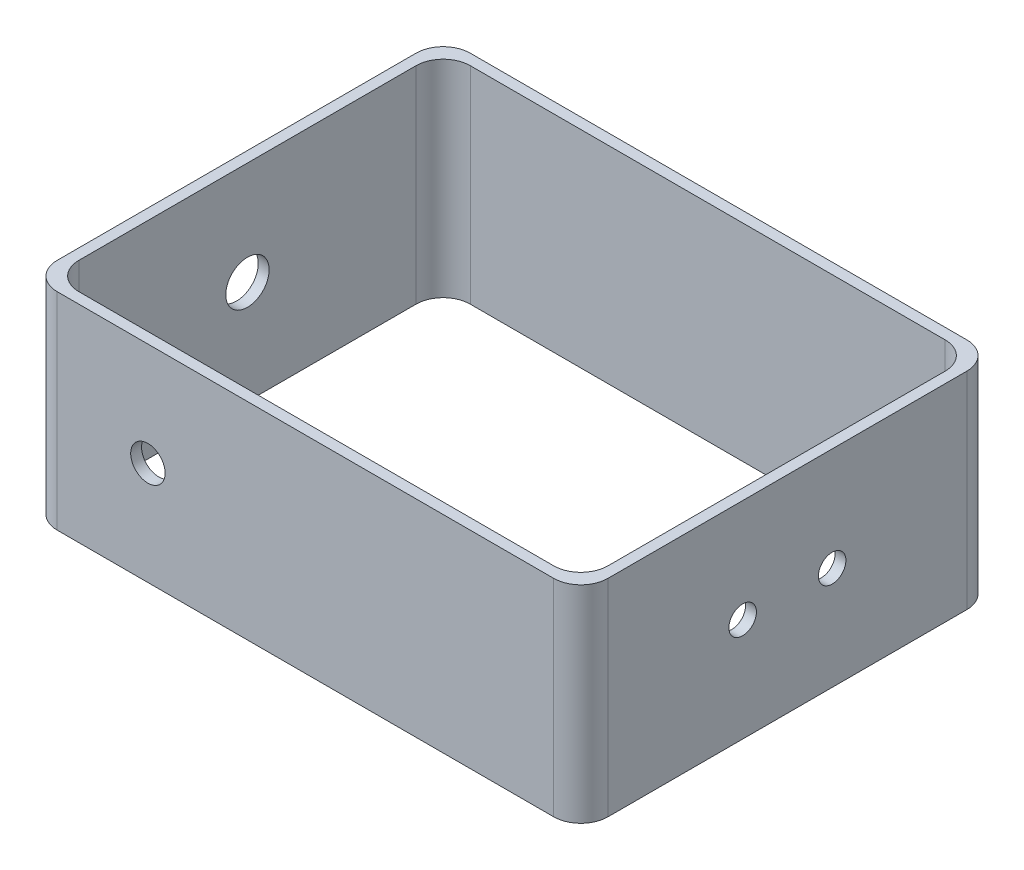
ISO-10303-21;
HEADER;
FILE_DESCRIPTION(('STEP AP214'),'2;1');
FILE_NAME('part.step','',(''),(''),'','','');
FILE_SCHEMA(('AUTOMOTIVE_DESIGN { 1 0 10303 214 1 1 1 1 }'));
ENDSEC;
DATA;
#1=APPLICATION_CONTEXT('core data for automotive mechanical design processes');
#2=APPLICATION_PROTOCOL_DEFINITION('international standard','automotive_design',2000,#1);
#3=PRODUCT_CONTEXT('',#1,'mechanical');
#4=PRODUCT('Part','Part','',(#3));
#5=PRODUCT_RELATED_PRODUCT_CATEGORY('part','',(#4));
#6=PRODUCT_DEFINITION_FORMATION('','',#4);
#7=PRODUCT_DEFINITION_CONTEXT('part definition',#1,'design');
#8=PRODUCT_DEFINITION('design','',#6,#7);
#9=PRODUCT_DEFINITION_SHAPE('','',#8);
#10=(LENGTH_UNIT() NAMED_UNIT(*) SI_UNIT(.MILLI.,.METRE.));
#11=(NAMED_UNIT(*) PLANE_ANGLE_UNIT() SI_UNIT($,.RADIAN.));
#12=(NAMED_UNIT(*) SI_UNIT($,.STERADIAN.) SOLID_ANGLE_UNIT());
#13=UNCERTAINTY_MEASURE_WITH_UNIT(LENGTH_MEASURE(1.E-05),#10,'distance_accuracy_value','');
#14=(GEOMETRIC_REPRESENTATION_CONTEXT(3) GLOBAL_UNCERTAINTY_ASSIGNED_CONTEXT((#13)) GLOBAL_UNIT_ASSIGNED_CONTEXT((#10,
#11,#12)) REPRESENTATION_CONTEXT('',''));
#15=CARTESIAN_POINT('',(0.,0.,0.));
#16=DIRECTION('',(0.,0.,1.));
#17=DIRECTION('',(1.,0.,0.));
#18=AXIS2_PLACEMENT_3D('',#15,#16,#17);
#19=CARTESIAN_POINT('',(50.8,38.1,-38.1));
#20=DIRECTION('',(-1.,0.,0.));
#21=DIRECTION('',(0.,0.,1.));
#22=AXIS2_PLACEMENT_3D('',#19,#20,#21);
#23=PLANE('',#22);
#24=CARTESIAN_POINT('',(50.8,19.05,-8.25500000000002));
#25=DIRECTION('',(1.,0.,0.));
#26=DIRECTION('',(0.,0.,-1.));
#27=AXIS2_PLACEMENT_3D('',#24,#25,#26);
#28=CIRCLE('',#27,2.54);
#29=CARTESIAN_POINT('',(50.8,19.05,-10.795));
#30=VERTEX_POINT('',#29);
#31=EDGE_CURVE('E494',#30,#30,#28,.T.);
#32=ORIENTED_EDGE('',*,*,#31,.F.);
#33=EDGE_LOOP('',(#32));
#34=FACE_BOUND('',#33,.T.);
#35=CARTESIAN_POINT('',(50.8,19.05,8.25499999999998));
#36=DIRECTION('',(1.,0.,0.));
#37=DIRECTION('',(0.,0.,-1.));
#38=AXIS2_PLACEMENT_3D('',#35,#36,#37);
#39=CIRCLE('',#38,2.54);
#40=CARTESIAN_POINT('',(50.8,19.05,5.71499999999998));
#41=VERTEX_POINT('',#40);
#42=EDGE_CURVE('E269',#41,#41,#39,.T.);
#43=ORIENTED_EDGE('',*,*,#42,.F.);
#44=EDGE_LOOP('',(#43));
#45=FACE_BOUND('',#44,.T.);
#46=DIRECTION('',(0.,0.,-1.));
#47=VECTOR('',#46,1.);
#48=CARTESIAN_POINT('',(50.8,0.,-38.1));
#49=LINE('',#48,#47);
#50=CARTESIAN_POINT('',(50.8,0.,33.1));
#51=VERTEX_POINT('',#50);
#52=CARTESIAN_POINT('',(50.8,0.,-33.1));
#53=VERTEX_POINT('',#52);
#54=EDGE_CURVE('E274',#51,#53,#49,.T.);
#55=ORIENTED_EDGE('',*,*,#54,.T.);
#56=DIRECTION('',(0.,-1.,0.));
#57=VECTOR('',#56,1.);
#58=CARTESIAN_POINT('',(50.8,38.1,-33.1));
#59=LINE('',#58,#57);
#60=CARTESIAN_POINT('',(50.8,38.1,-33.1));
#61=VERTEX_POINT('',#60);
#62=EDGE_CURVE('E209',#53,#61,#59,.F.);
#63=ORIENTED_EDGE('',*,*,#62,.T.);
#64=DIRECTION('',(0.,0.,-1.));
#65=VECTOR('',#64,1.);
#66=CARTESIAN_POINT('',(50.8,38.1,-38.1));
#67=LINE('',#66,#65);
#68=CARTESIAN_POINT('',(50.8,38.1,33.1));
#69=VERTEX_POINT('',#68);
#70=EDGE_CURVE('E175',#69,#61,#67,.T.);
#71=ORIENTED_EDGE('',*,*,#70,.F.);
#72=DIRECTION('',(0.,-1.,0.));
#73=VECTOR('',#72,1.);
#74=CARTESIAN_POINT('',(50.8,38.1,33.1));
#75=LINE('',#74,#73);
#76=EDGE_CURVE('E206',#69,#51,#75,.T.);
#77=ORIENTED_EDGE('',*,*,#76,.T.);
#78=EDGE_LOOP('',(#55,#63,#71,#77));
#79=FACE_BOUND('',#78,.T.);
#80=ADVANCED_FACE('F35',(#34,#45,#79),#23,.F.);
#81=CARTESIAN_POINT('',(-50.8,38.1,-38.1));
#82=DIRECTION('',(0.,0.,1.));
#83=DIRECTION('',(1.,0.,0.));
#84=AXIS2_PLACEMENT_3D('',#81,#82,#83);
#85=PLANE('',#84);
#86=DIRECTION('',(-1.,0.,0.));
#87=VECTOR('',#86,1.);
#88=CARTESIAN_POINT('',(-50.8,0.,-38.1));
#89=LINE('',#88,#87);
#90=CARTESIAN_POINT('',(45.8,0.,-38.1));
#91=VERTEX_POINT('',#90);
#92=CARTESIAN_POINT('',(-45.8,0.,-38.1));
#93=VERTEX_POINT('',#92);
#94=EDGE_CURVE('E181',#91,#93,#89,.T.);
#95=ORIENTED_EDGE('',*,*,#94,.T.);
#96=DIRECTION('',(0.,-1.,0.));
#97=VECTOR('',#96,1.);
#98=CARTESIAN_POINT('',(-45.8,38.1,-38.1));
#99=LINE('',#98,#97);
#100=CARTESIAN_POINT('',(-45.8,38.1,-38.1));
#101=VERTEX_POINT('',#100);
#102=EDGE_CURVE('E204',#93,#101,#99,.F.);
#103=ORIENTED_EDGE('',*,*,#102,.T.);
#104=DIRECTION('',(-1.,0.,0.));
#105=VECTOR('',#104,1.);
#106=CARTESIAN_POINT('',(-50.8,38.1,-38.1));
#107=LINE('',#106,#105);
#108=CARTESIAN_POINT('',(45.8,38.1,-38.1));
#109=VERTEX_POINT('',#108);
#110=EDGE_CURVE('E179',#109,#101,#107,.T.);
#111=ORIENTED_EDGE('',*,*,#110,.F.);
#112=DIRECTION('',(0.,-1.,0.));
#113=VECTOR('',#112,1.);
#114=CARTESIAN_POINT('',(45.8,38.1,-38.1));
#115=LINE('',#114,#113);
#116=EDGE_CURVE('E201',#109,#91,#115,.T.);
#117=ORIENTED_EDGE('',*,*,#116,.T.);
#118=EDGE_LOOP('',(#95,#103,#111,#117));
#119=FACE_BOUND('',#118,.T.);
#120=ADVANCED_FACE('F293',(#119),#85,.F.);
#121=CARTESIAN_POINT('',(-50.8,38.1,-38.1));
#122=DIRECTION('',(1.,0.,0.));
#123=DIRECTION('',(0.,0.,-1.));
#124=AXIS2_PLACEMENT_3D('',#121,#122,#123);
#125=PLANE('',#124);
#126=CARTESIAN_POINT('',(-50.8,19.05,0.));
#127=DIRECTION('',(-1.,0.,0.));
#128=DIRECTION('',(0.,0.,1.));
#129=AXIS2_PLACEMENT_3D('',#126,#127,#128);
#130=CIRCLE('',#129,4.);
#131=CARTESIAN_POINT('',(-50.8,19.05,4.00000000000001));
#132=VERTEX_POINT('',#131);
#133=EDGE_CURVE('E499',#132,#132,#130,.T.);
#134=ORIENTED_EDGE('',*,*,#133,.F.);
#135=EDGE_LOOP('',(#134));
#136=FACE_BOUND('',#135,.T.);
#137=DIRECTION('',(0.,0.,1.));
#138=VECTOR('',#137,1.);
#139=CARTESIAN_POINT('',(-50.8,0.,-38.1));
#140=LINE('',#139,#138);
#141=CARTESIAN_POINT('',(-50.8,0.,-33.1));
#142=VERTEX_POINT('',#141);
#143=CARTESIAN_POINT('',(-50.8,0.,33.1));
#144=VERTEX_POINT('',#143);
#145=EDGE_CURVE('E176',#142,#144,#140,.T.);
#146=ORIENTED_EDGE('',*,*,#145,.T.);
#147=DIRECTION('',(0.,-1.,0.));
#148=VECTOR('',#147,1.);
#149=CARTESIAN_POINT('',(-50.8,38.1,33.1));
#150=LINE('',#149,#148);
#151=CARTESIAN_POINT('',(-50.8,38.1,33.1));
#152=VERTEX_POINT('',#151);
#153=EDGE_CURVE('E154',#144,#152,#150,.F.);
#154=ORIENTED_EDGE('',*,*,#153,.T.);
#155=DIRECTION('',(0.,0.,1.));
#156=VECTOR('',#155,1.);
#157=CARTESIAN_POINT('',(-50.8,38.1,-38.1));
#158=LINE('',#157,#156);
#159=CARTESIAN_POINT('',(-50.8,38.1,-33.1));
#160=VERTEX_POINT('',#159);
#161=EDGE_CURVE('E284',#160,#152,#158,.T.);
#162=ORIENTED_EDGE('',*,*,#161,.F.);
#163=DIRECTION('',(0.,-1.,0.));
#164=VECTOR('',#163,1.);
#165=CARTESIAN_POINT('',(-50.8,38.1,-33.1));
#166=LINE('',#165,#164);
#167=EDGE_CURVE('E159',#160,#142,#166,.T.);
#168=ORIENTED_EDGE('',*,*,#167,.T.);
#169=EDGE_LOOP('',(#146,#154,#162,#168));
#170=FACE_BOUND('',#169,.T.);
#171=ADVANCED_FACE('F302',(#136,#170),#125,.F.);
#172=CARTESIAN_POINT('',(-50.8,38.1,38.1));
#173=DIRECTION('',(0.,0.,-1.));
#174=DIRECTION('',(-1.,0.,0.));
#175=AXIS2_PLACEMENT_3D('',#172,#173,#174);
#176=PLANE('',#175);
#177=CARTESIAN_POINT('',(-29.0611601393493,19.05,38.1));
#178=DIRECTION('',(0.,0.,1.));
#179=DIRECTION('',(1.,0.,0.));
#180=AXIS2_PLACEMENT_3D('',#177,#178,#179);
#181=CIRCLE('',#180,3.175);
#182=CARTESIAN_POINT('',(-25.8861601393493,19.05,38.1));
#183=VERTEX_POINT('',#182);
#184=EDGE_CURVE('E516',#183,#183,#181,.T.);
#185=ORIENTED_EDGE('',*,*,#184,.F.);
#186=EDGE_LOOP('',(#185));
#187=FACE_BOUND('',#186,.T.);
#188=DIRECTION('',(1.,0.,0.));
#189=VECTOR('',#188,1.);
#190=CARTESIAN_POINT('',(-50.8,38.1,38.1));
#191=LINE('',#190,#189);
#192=CARTESIAN_POINT('',(-45.8,38.1,38.1));
#193=VERTEX_POINT('',#192);
#194=CARTESIAN_POINT('',(45.8,38.1,38.1));
#195=VERTEX_POINT('',#194);
#196=EDGE_CURVE('E169',#193,#195,#191,.T.);
#197=ORIENTED_EDGE('',*,*,#196,.F.);
#198=DIRECTION('',(0.,-1.,0.));
#199=VECTOR('',#198,1.);
#200=CARTESIAN_POINT('',(-45.8,38.1,38.1));
#201=LINE('',#200,#199);
#202=CARTESIAN_POINT('',(-45.8,0.,38.1));
#203=VERTEX_POINT('',#202);
#204=EDGE_CURVE('E153',#193,#203,#201,.T.);
#205=ORIENTED_EDGE('',*,*,#204,.T.);
#206=DIRECTION('',(1.,0.,0.));
#207=VECTOR('',#206,1.);
#208=CARTESIAN_POINT('',(-50.8,0.,38.1));
#209=LINE('',#208,#207);
#210=CARTESIAN_POINT('',(45.8,0.,38.1));
#211=VERTEX_POINT('',#210);
#212=EDGE_CURVE('E166',#203,#211,#209,.T.);
#213=ORIENTED_EDGE('',*,*,#212,.T.);
#214=DIRECTION('',(0.,-1.,0.));
#215=VECTOR('',#214,1.);
#216=CARTESIAN_POINT('',(45.8,38.1,38.1));
#217=LINE('',#216,#215);
#218=EDGE_CURVE('E171',#211,#195,#217,.F.);
#219=ORIENTED_EDGE('',*,*,#218,.T.);
#220=EDGE_LOOP('',(#197,#205,#213,#219));
#221=FACE_BOUND('',#220,.T.);
#222=ADVANCED_FACE('F165',(#187,#221),#176,.F.);
#223=CARTESIAN_POINT('',(0.,38.1,0.));
#224=DIRECTION('',(0.,1.,0.));
#225=DIRECTION('',(0.,0.,1.));
#226=AXIS2_PLACEMENT_3D('',#223,#224,#225);
#227=PLANE('',#226);
#228=DIRECTION('',(1.,0.,0.));
#229=VECTOR('',#228,1.);
#230=CARTESIAN_POINT('',(-48.8,38.1,36.1));
#231=LINE('',#230,#229);
#232=CARTESIAN_POINT('',(-43.8,38.1,36.1));
#233=VERTEX_POINT('',#232);
#234=CARTESIAN_POINT('',(43.8,38.1,36.1));
#235=VERTEX_POINT('',#234);
#236=EDGE_CURVE('E247',#233,#235,#231,.T.);
#237=ORIENTED_EDGE('',*,*,#236,.F.);
#238=CARTESIAN_POINT('',(-43.8,38.1,31.1));
#239=DIRECTION('',(0.,1.,0.));
#240=DIRECTION('',(0.,0.,1.));
#241=AXIS2_PLACEMENT_3D('',#238,#239,#240);
#242=CIRCLE('',#241,5.);
#243=CARTESIAN_POINT('',(-48.8,38.1,31.1));
#244=VERTEX_POINT('',#243);
#245=EDGE_CURVE('E43',#233,#244,#242,.F.);
#246=ORIENTED_EDGE('',*,*,#245,.T.);
#247=DIRECTION('',(0.,0.,1.));
#248=VECTOR('',#247,1.);
#249=CARTESIAN_POINT('',(-48.8,38.1,-36.1));
#250=LINE('',#249,#248);
#251=CARTESIAN_POINT('',(-48.8,38.1,-31.1));
#252=VERTEX_POINT('',#251);
#253=EDGE_CURVE('E245',#252,#244,#250,.T.);
#254=ORIENTED_EDGE('',*,*,#253,.F.);
#255=CARTESIAN_POINT('',(-43.8,38.1,-31.1));
#256=DIRECTION('',(0.,1.,0.));
#257=DIRECTION('',(0.,0.,1.));
#258=AXIS2_PLACEMENT_3D('',#255,#256,#257);
#259=CIRCLE('',#258,5.);
#260=CARTESIAN_POINT('',(-43.8,38.1,-36.1));
#261=VERTEX_POINT('',#260);
#262=EDGE_CURVE('E238',#252,#261,#259,.F.);
#263=ORIENTED_EDGE('',*,*,#262,.T.);
#264=DIRECTION('',(-1.,0.,0.));
#265=VECTOR('',#264,1.);
#266=CARTESIAN_POINT('',(48.8,38.1,-36.1));
#267=LINE('',#266,#265);
#268=CARTESIAN_POINT('',(43.8,38.1,-36.1));
#269=VERTEX_POINT('',#268);
#270=EDGE_CURVE('E253',#269,#261,#267,.T.);
#271=ORIENTED_EDGE('',*,*,#270,.F.);
#272=CARTESIAN_POINT('',(43.8,38.1,-31.1));
#273=DIRECTION('',(0.,1.,0.));
#274=DIRECTION('',(0.,0.,1.));
#275=AXIS2_PLACEMENT_3D('',#272,#273,#274);
#276=CIRCLE('',#275,5.);
#277=CARTESIAN_POINT('',(48.8,38.1,-31.1));
#278=VERTEX_POINT('',#277);
#279=EDGE_CURVE('E230',#269,#278,#276,.F.);
#280=ORIENTED_EDGE('',*,*,#279,.T.);
#281=DIRECTION('',(0.,0.,-1.));
#282=VECTOR('',#281,1.);
#283=CARTESIAN_POINT('',(48.8,38.1,36.1));
#284=LINE('',#283,#282);
#285=CARTESIAN_POINT('',(48.8,38.1,31.1));
#286=VERTEX_POINT('',#285);
#287=EDGE_CURVE('E276',#286,#278,#284,.T.);
#288=ORIENTED_EDGE('',*,*,#287,.F.);
#289=CARTESIAN_POINT('',(43.8,38.1,31.1));
#290=DIRECTION('',(0.,1.,0.));
#291=DIRECTION('',(0.,0.,1.));
#292=AXIS2_PLACEMENT_3D('',#289,#290,#291);
#293=CIRCLE('',#292,5.);
#294=EDGE_CURVE('E234',#286,#235,#293,.F.);
#295=ORIENTED_EDGE('',*,*,#294,.T.);
#296=EDGE_LOOP('',(#237,#246,#254,#263,#271,#280,#288,#295));
#297=FACE_BOUND('',#296,.T.);
#298=ORIENTED_EDGE('',*,*,#161,.T.);
#299=CARTESIAN_POINT('',(-45.8,38.1,33.1));
#300=DIRECTION('',(0.,1.,0.));
#301=DIRECTION('',(0.,0.,1.));
#302=AXIS2_PLACEMENT_3D('',#299,#300,#301);
#303=CIRCLE('',#302,5.);
#304=EDGE_CURVE('E199',#152,#193,#303,.T.);
#305=ORIENTED_EDGE('',*,*,#304,.T.);
#306=ORIENTED_EDGE('',*,*,#196,.T.);
#307=CARTESIAN_POINT('',(45.8,38.1,33.1));
#308=DIRECTION('',(0.,1.,0.));
#309=DIRECTION('',(0.,0.,1.));
#310=AXIS2_PLACEMENT_3D('',#307,#308,#309);
#311=CIRCLE('',#310,5.);
#312=EDGE_CURVE('E193',#195,#69,#311,.T.);
#313=ORIENTED_EDGE('',*,*,#312,.T.);
#314=ORIENTED_EDGE('',*,*,#70,.T.);
#315=CARTESIAN_POINT('',(45.8,38.1,-33.1));
#316=DIRECTION('',(0.,1.,0.));
#317=DIRECTION('',(0.,0.,1.));
#318=AXIS2_PLACEMENT_3D('',#315,#316,#317);
#319=CIRCLE('',#318,5.);
#320=EDGE_CURVE('E195',#61,#109,#319,.T.);
#321=ORIENTED_EDGE('',*,*,#320,.T.);
#322=ORIENTED_EDGE('',*,*,#110,.T.);
#323=CARTESIAN_POINT('',(-45.8,38.1,-33.1));
#324=DIRECTION('',(0.,1.,0.));
#325=DIRECTION('',(0.,0.,1.));
#326=AXIS2_PLACEMENT_3D('',#323,#324,#325);
#327=CIRCLE('',#326,5.);
#328=EDGE_CURVE('E197',#101,#160,#327,.T.);
#329=ORIENTED_EDGE('',*,*,#328,.T.);
#330=EDGE_LOOP('',(#298,#305,#306,#313,#314,#321,#322,#329));
#331=FACE_BOUND('',#330,.T.);
#332=ADVANCED_FACE('F243',(#297,#331),#227,.T.);
#333=CARTESIAN_POINT('',(0.,0.,0.));
#334=DIRECTION('',(0.,1.,0.));
#335=DIRECTION('',(0.,0.,1.));
#336=AXIS2_PLACEMENT_3D('',#333,#334,#335);
#337=PLANE('',#336);
#338=DIRECTION('',(-1.,0.,0.));
#339=VECTOR('',#338,1.);
#340=CARTESIAN_POINT('',(48.8,0.,-36.1));
#341=LINE('',#340,#339);
#342=CARTESIAN_POINT('',(43.8,0.,-36.1));
#343=VERTEX_POINT('',#342);
#344=CARTESIAN_POINT('',(-43.8,0.,-36.1));
#345=VERTEX_POINT('',#344);
#346=EDGE_CURVE('E266',#343,#345,#341,.T.);
#347=ORIENTED_EDGE('',*,*,#346,.T.);
#348=CARTESIAN_POINT('',(-43.8,0.,-31.1));
#349=DIRECTION('',(0.,1.,0.));
#350=DIRECTION('',(0.,0.,1.));
#351=AXIS2_PLACEMENT_3D('',#348,#349,#350);
#352=CIRCLE('',#351,5.);
#353=CARTESIAN_POINT('',(-48.8,0.,-31.1));
#354=VERTEX_POINT('',#353);
#355=EDGE_CURVE('E57',#345,#354,#352,.T.);
#356=ORIENTED_EDGE('',*,*,#355,.T.);
#357=DIRECTION('',(0.,0.,1.));
#358=VECTOR('',#357,1.);
#359=CARTESIAN_POINT('',(-48.8,0.,-36.1));
#360=LINE('',#359,#358);
#361=CARTESIAN_POINT('',(-48.8,0.,31.1));
#362=VERTEX_POINT('',#361);
#363=EDGE_CURVE('E259',#354,#362,#360,.T.);
#364=ORIENTED_EDGE('',*,*,#363,.T.);
#365=CARTESIAN_POINT('',(-43.8,0.,31.1));
#366=DIRECTION('',(0.,1.,0.));
#367=DIRECTION('',(0.,0.,1.));
#368=AXIS2_PLACEMENT_3D('',#365,#366,#367);
#369=CIRCLE('',#368,5.);
#370=CARTESIAN_POINT('',(-43.8,0.,36.1));
#371=VERTEX_POINT('',#370);
#372=EDGE_CURVE('E11',#362,#371,#369,.T.);
#373=ORIENTED_EDGE('',*,*,#372,.T.);
#374=DIRECTION('',(1.,0.,0.));
#375=VECTOR('',#374,1.);
#376=CARTESIAN_POINT('',(-48.8,0.,36.1));
#377=LINE('',#376,#375);
#378=CARTESIAN_POINT('',(43.8,0.,36.1));
#379=VERTEX_POINT('',#378);
#380=EDGE_CURVE('E252',#371,#379,#377,.T.);
#381=ORIENTED_EDGE('',*,*,#380,.T.);
#382=CARTESIAN_POINT('',(43.8,0.,31.1));
#383=DIRECTION('',(0.,1.,0.));
#384=DIRECTION('',(0.,0.,1.));
#385=AXIS2_PLACEMENT_3D('',#382,#383,#384);
#386=CIRCLE('',#385,5.);
#387=CARTESIAN_POINT('',(48.8,0.,31.1));
#388=VERTEX_POINT('',#387);
#389=EDGE_CURVE('E236',#379,#388,#386,.T.);
#390=ORIENTED_EDGE('',*,*,#389,.T.);
#391=DIRECTION('',(0.,0.,-1.));
#392=VECTOR('',#391,1.);
#393=CARTESIAN_POINT('',(48.8,0.,36.1));
#394=LINE('',#393,#392);
#395=CARTESIAN_POINT('',(48.8,0.,-31.1));
#396=VERTEX_POINT('',#395);
#397=EDGE_CURVE('E263',#388,#396,#394,.T.);
#398=ORIENTED_EDGE('',*,*,#397,.T.);
#399=CARTESIAN_POINT('',(43.8,0.,-31.1));
#400=DIRECTION('',(0.,1.,0.));
#401=DIRECTION('',(0.,0.,1.));
#402=AXIS2_PLACEMENT_3D('',#399,#400,#401);
#403=CIRCLE('',#402,5.);
#404=EDGE_CURVE('E232',#396,#343,#403,.T.);
#405=ORIENTED_EDGE('',*,*,#404,.T.);
#406=EDGE_LOOP('',(#347,#356,#364,#373,#381,#390,#398,#405));
#407=FACE_BOUND('',#406,.T.);
#408=ORIENTED_EDGE('',*,*,#212,.F.);
#409=CARTESIAN_POINT('',(-45.8,0.,33.1));
#410=DIRECTION('',(0.,1.,0.));
#411=DIRECTION('',(0.,0.,1.));
#412=AXIS2_PLACEMENT_3D('',#409,#410,#411);
#413=CIRCLE('',#412,5.);
#414=EDGE_CURVE('E149',#203,#144,#413,.F.);
#415=ORIENTED_EDGE('',*,*,#414,.T.);
#416=ORIENTED_EDGE('',*,*,#145,.F.);
#417=CARTESIAN_POINT('',(-45.8,0.,-33.1));
#418=DIRECTION('',(0.,1.,0.));
#419=DIRECTION('',(0.,0.,1.));
#420=AXIS2_PLACEMENT_3D('',#417,#418,#419);
#421=CIRCLE('',#420,5.);
#422=EDGE_CURVE('E160',#142,#93,#421,.F.);
#423=ORIENTED_EDGE('',*,*,#422,.T.);
#424=ORIENTED_EDGE('',*,*,#94,.F.);
#425=CARTESIAN_POINT('',(45.8,0.,-33.1));
#426=DIRECTION('',(0.,1.,0.));
#427=DIRECTION('',(0.,0.,1.));
#428=AXIS2_PLACEMENT_3D('',#425,#426,#427);
#429=CIRCLE('',#428,5.);
#430=EDGE_CURVE('E187',#91,#53,#429,.F.);
#431=ORIENTED_EDGE('',*,*,#430,.T.);
#432=ORIENTED_EDGE('',*,*,#54,.F.);
#433=CARTESIAN_POINT('',(45.8,0.,33.1));
#434=DIRECTION('',(0.,1.,0.));
#435=DIRECTION('',(0.,0.,1.));
#436=AXIS2_PLACEMENT_3D('',#433,#434,#435);
#437=CIRCLE('',#436,5.);
#438=EDGE_CURVE('E170',#51,#211,#437,.F.);
#439=ORIENTED_EDGE('',*,*,#438,.T.);
#440=EDGE_LOOP('',(#408,#415,#416,#423,#424,#431,#432,#439));
#441=FACE_BOUND('',#440,.T.);
#442=ADVANCED_FACE('F173',(#407,#441),#337,.F.);
#443=CARTESIAN_POINT('',(-48.8,0.,36.1));
#444=DIRECTION('',(0.,0.,1.));
#445=DIRECTION('',(1.,0.,0.));
#446=AXIS2_PLACEMENT_3D('',#443,#444,#445);
#447=PLANE('',#446);
#448=CARTESIAN_POINT('',(-29.0611601393493,19.05,36.1));
#449=DIRECTION('',(0.,0.,1.));
#450=DIRECTION('',(1.,0.,0.));
#451=AXIS2_PLACEMENT_3D('',#448,#449,#450);
#452=CIRCLE('',#451,3.175);
#453=CARTESIAN_POINT('',(-25.8861601393493,19.05,36.1));
#454=VERTEX_POINT('',#453);
#455=EDGE_CURVE('E514',#454,#454,#452,.T.);
#456=ORIENTED_EDGE('',*,*,#455,.T.);
#457=EDGE_LOOP('',(#456));
#458=FACE_BOUND('',#457,.T.);
#459=ORIENTED_EDGE('',*,*,#236,.T.);
#460=DIRECTION('',(0.,1.,0.));
#461=VECTOR('',#460,1.);
#462=CARTESIAN_POINT('',(43.8,0.,36.1));
#463=LINE('',#462,#461);
#464=EDGE_CURVE('E224',#235,#379,#463,.F.);
#465=ORIENTED_EDGE('',*,*,#464,.T.);
#466=ORIENTED_EDGE('',*,*,#380,.F.);
#467=DIRECTION('',(0.,1.,0.));
#468=VECTOR('',#467,1.);
#469=CARTESIAN_POINT('',(-43.8,38.1,36.1));
#470=LINE('',#469,#468);
#471=EDGE_CURVE('E221',#371,#233,#470,.T.);
#472=ORIENTED_EDGE('',*,*,#471,.T.);
#473=EDGE_LOOP('',(#459,#465,#466,#472));
#474=FACE_BOUND('',#473,.T.);
#475=ADVANCED_FACE('F261',(#458,#474),#447,.F.);
#476=CARTESIAN_POINT('',(-48.8,0.,-36.1));
#477=DIRECTION('',(-1.,0.,0.));
#478=DIRECTION('',(0.,0.,1.));
#479=AXIS2_PLACEMENT_3D('',#476,#477,#478);
#480=PLANE('',#479);
#481=CARTESIAN_POINT('',(-48.8,19.05,0.));
#482=DIRECTION('',(-1.,0.,0.));
#483=DIRECTION('',(0.,0.,1.));
#484=AXIS2_PLACEMENT_3D('',#481,#482,#483);
#485=CIRCLE('',#484,4.);
#486=CARTESIAN_POINT('',(-48.8,19.05,4.00000000000001));
#487=VERTEX_POINT('',#486);
#488=EDGE_CURVE('E495',#487,#487,#485,.T.);
#489=ORIENTED_EDGE('',*,*,#488,.T.);
#490=EDGE_LOOP('',(#489));
#491=FACE_BOUND('',#490,.T.);
#492=ORIENTED_EDGE('',*,*,#363,.F.);
#493=DIRECTION('',(0.,1.,0.));
#494=VECTOR('',#493,1.);
#495=CARTESIAN_POINT('',(-48.8,38.1,-31.1));
#496=LINE('',#495,#494);
#497=EDGE_CURVE('E227',#354,#252,#496,.T.);
#498=ORIENTED_EDGE('',*,*,#497,.T.);
#499=ORIENTED_EDGE('',*,*,#253,.T.);
#500=DIRECTION('',(0.,1.,0.));
#501=VECTOR('',#500,1.);
#502=CARTESIAN_POINT('',(-48.8,0.,31.1));
#503=LINE('',#502,#501);
#504=EDGE_CURVE('E50',#244,#362,#503,.F.);
#505=ORIENTED_EDGE('',*,*,#504,.T.);
#506=EDGE_LOOP('',(#492,#498,#499,#505));
#507=FACE_BOUND('',#506,.T.);
#508=ADVANCED_FACE('F250',(#491,#507),#480,.F.);
#509=CARTESIAN_POINT('',(48.8,0.,-36.1));
#510=DIRECTION('',(0.,0.,-1.));
#511=DIRECTION('',(-1.,0.,0.));
#512=AXIS2_PLACEMENT_3D('',#509,#510,#511);
#513=PLANE('',#512);
#514=ORIENTED_EDGE('',*,*,#346,.F.);
#515=DIRECTION('',(0.,1.,0.));
#516=VECTOR('',#515,1.);
#517=CARTESIAN_POINT('',(43.8,38.1,-36.1));
#518=LINE('',#517,#516);
#519=EDGE_CURVE('E213',#343,#269,#518,.T.);
#520=ORIENTED_EDGE('',*,*,#519,.T.);
#521=ORIENTED_EDGE('',*,*,#270,.T.);
#522=DIRECTION('',(0.,1.,0.));
#523=VECTOR('',#522,1.);
#524=CARTESIAN_POINT('',(-43.8,0.,-36.1));
#525=LINE('',#524,#523);
#526=EDGE_CURVE('E211',#261,#345,#525,.F.);
#527=ORIENTED_EDGE('',*,*,#526,.T.);
#528=EDGE_LOOP('',(#514,#520,#521,#527));
#529=FACE_BOUND('',#528,.T.);
#530=ADVANCED_FACE('F352',(#529),#513,.F.);
#531=CARTESIAN_POINT('',(48.8,0.,36.1));
#532=DIRECTION('',(1.,0.,0.));
#533=DIRECTION('',(0.,0.,-1.));
#534=AXIS2_PLACEMENT_3D('',#531,#532,#533);
#535=PLANE('',#534);
#536=CARTESIAN_POINT('',(48.8,19.05,-8.25500000000002));
#537=DIRECTION('',(1.,0.,0.));
#538=DIRECTION('',(0.,0.,-1.));
#539=AXIS2_PLACEMENT_3D('',#536,#537,#538);
#540=CIRCLE('',#539,2.54);
#541=CARTESIAN_POINT('',(48.8,19.05,-10.795));
#542=VERTEX_POINT('',#541);
#543=EDGE_CURVE('E492',#542,#542,#540,.T.);
#544=ORIENTED_EDGE('',*,*,#543,.T.);
#545=EDGE_LOOP('',(#544));
#546=FACE_BOUND('',#545,.T.);
#547=CARTESIAN_POINT('',(48.8,19.05,8.25499999999998));
#548=DIRECTION('',(1.,0.,0.));
#549=DIRECTION('',(0.,0.,-1.));
#550=AXIS2_PLACEMENT_3D('',#547,#548,#549);
#551=CIRCLE('',#550,2.54);
#552=CARTESIAN_POINT('',(48.8,19.05,5.71499999999998));
#553=VERTEX_POINT('',#552);
#554=EDGE_CURVE('E277',#553,#553,#551,.T.);
#555=ORIENTED_EDGE('',*,*,#554,.T.);
#556=EDGE_LOOP('',(#555));
#557=FACE_BOUND('',#556,.T.);
#558=ORIENTED_EDGE('',*,*,#287,.T.);
#559=DIRECTION('',(0.,1.,0.));
#560=VECTOR('',#559,1.);
#561=CARTESIAN_POINT('',(48.8,0.,-31.1));
#562=LINE('',#561,#560);
#563=EDGE_CURVE('E219',#278,#396,#562,.F.);
#564=ORIENTED_EDGE('',*,*,#563,.T.);
#565=ORIENTED_EDGE('',*,*,#397,.F.);
#566=DIRECTION('',(0.,1.,0.));
#567=VECTOR('',#566,1.);
#568=CARTESIAN_POINT('',(48.8,38.1,31.1));
#569=LINE('',#568,#567);
#570=EDGE_CURVE('E216',#388,#286,#569,.T.);
#571=ORIENTED_EDGE('',*,*,#570,.T.);
#572=EDGE_LOOP('',(#558,#564,#565,#571));
#573=FACE_BOUND('',#572,.T.);
#574=ADVANCED_FACE('F358',(#546,#557,#573),#535,.F.);
#575=CARTESIAN_POINT('',(48.8,19.05,8.25499999999998));
#576=DIRECTION('',(1.,0.,0.));
#577=DIRECTION('',(0.,0.,-1.));
#578=AXIS2_PLACEMENT_3D('',#575,#576,#577);
#579=CYLINDRICAL_SURFACE('',#578,2.54);
#580=ORIENTED_EDGE('',*,*,#554,.F.);
#581=EDGE_LOOP('',(#580));
#582=FACE_BOUND('',#581,.T.);
#583=ORIENTED_EDGE('',*,*,#42,.T.);
#584=EDGE_LOOP('',(#583));
#585=FACE_BOUND('',#584,.T.);
#586=ADVANCED_FACE('F362',(#582,#585),#579,.F.);
#587=CARTESIAN_POINT('',(48.8,19.05,-8.25500000000002));
#588=DIRECTION('',(1.,0.,0.));
#589=DIRECTION('',(0.,0.,-1.));
#590=AXIS2_PLACEMENT_3D('',#587,#588,#589);
#591=CYLINDRICAL_SURFACE('',#590,2.54);
#592=ORIENTED_EDGE('',*,*,#543,.F.);
#593=EDGE_LOOP('',(#592));
#594=FACE_BOUND('',#593,.T.);
#595=ORIENTED_EDGE('',*,*,#31,.T.);
#596=EDGE_LOOP('',(#595));
#597=FACE_BOUND('',#596,.T.);
#598=ADVANCED_FACE('F369',(#594,#597),#591,.F.);
#599=CARTESIAN_POINT('',(-48.8,19.05,0.));
#600=DIRECTION('',(-1.,0.,0.));
#601=DIRECTION('',(0.,0.,1.));
#602=AXIS2_PLACEMENT_3D('',#599,#600,#601);
#603=CYLINDRICAL_SURFACE('',#602,4.);
#604=ORIENTED_EDGE('',*,*,#488,.F.);
#605=EDGE_LOOP('',(#604));
#606=FACE_BOUND('',#605,.T.);
#607=ORIENTED_EDGE('',*,*,#133,.T.);
#608=EDGE_LOOP('',(#607));
#609=FACE_BOUND('',#608,.T.);
#610=ADVANCED_FACE('F453',(#606,#609),#603,.F.);
#611=CARTESIAN_POINT('',(-29.0611601393493,19.05,36.1));
#612=DIRECTION('',(0.,0.,1.));
#613=DIRECTION('',(1.,0.,0.));
#614=AXIS2_PLACEMENT_3D('',#611,#612,#613);
#615=CYLINDRICAL_SURFACE('',#614,3.175);
#616=ORIENTED_EDGE('',*,*,#455,.F.);
#617=EDGE_LOOP('',(#616));
#618=FACE_BOUND('',#617,.T.);
#619=ORIENTED_EDGE('',*,*,#184,.T.);
#620=EDGE_LOOP('',(#619));
#621=FACE_BOUND('',#620,.T.);
#622=ADVANCED_FACE('F324',(#618,#621),#615,.F.);
#623=CARTESIAN_POINT('',(-45.8,38.1,33.1));
#624=DIRECTION('',(0.,-1.,0.));
#625=DIRECTION('',(0.,0.,-1.));
#626=AXIS2_PLACEMENT_3D('',#623,#624,#625);
#627=CYLINDRICAL_SURFACE('',#626,5.);
#628=ORIENTED_EDGE('',*,*,#304,.F.);
#629=ORIENTED_EDGE('',*,*,#153,.F.);
#630=ORIENTED_EDGE('',*,*,#414,.F.);
#631=ORIENTED_EDGE('',*,*,#204,.F.);
#632=EDGE_LOOP('',(#628,#629,#630,#631));
#633=FACE_BOUND('',#632,.T.);
#634=ADVANCED_FACE('F152',(#633),#627,.T.);
#635=CARTESIAN_POINT('',(-45.8,38.1,-33.1));
#636=DIRECTION('',(0.,-1.,0.));
#637=DIRECTION('',(0.,0.,-1.));
#638=AXIS2_PLACEMENT_3D('',#635,#636,#637);
#639=CYLINDRICAL_SURFACE('',#638,5.);
#640=ORIENTED_EDGE('',*,*,#328,.F.);
#641=ORIENTED_EDGE('',*,*,#102,.F.);
#642=ORIENTED_EDGE('',*,*,#422,.F.);
#643=ORIENTED_EDGE('',*,*,#167,.F.);
#644=EDGE_LOOP('',(#640,#641,#642,#643));
#645=FACE_BOUND('',#644,.T.);
#646=ADVANCED_FACE('F298',(#645),#639,.T.);
#647=CARTESIAN_POINT('',(45.8,38.1,-33.1));
#648=DIRECTION('',(0.,-1.,0.));
#649=DIRECTION('',(0.,0.,-1.));
#650=AXIS2_PLACEMENT_3D('',#647,#648,#649);
#651=CYLINDRICAL_SURFACE('',#650,5.);
#652=ORIENTED_EDGE('',*,*,#320,.F.);
#653=ORIENTED_EDGE('',*,*,#62,.F.);
#654=ORIENTED_EDGE('',*,*,#430,.F.);
#655=ORIENTED_EDGE('',*,*,#116,.F.);
#656=EDGE_LOOP('',(#652,#653,#654,#655));
#657=FACE_BOUND('',#656,.T.);
#658=ADVANCED_FACE('F327',(#657),#651,.T.);
#659=CARTESIAN_POINT('',(45.8,38.1,33.1));
#660=DIRECTION('',(0.,-1.,0.));
#661=DIRECTION('',(0.,0.,-1.));
#662=AXIS2_PLACEMENT_3D('',#659,#660,#661);
#663=CYLINDRICAL_SURFACE('',#662,5.);
#664=ORIENTED_EDGE('',*,*,#312,.F.);
#665=ORIENTED_EDGE('',*,*,#218,.F.);
#666=ORIENTED_EDGE('',*,*,#438,.F.);
#667=ORIENTED_EDGE('',*,*,#76,.F.);
#668=EDGE_LOOP('',(#664,#665,#666,#667));
#669=FACE_BOUND('',#668,.T.);
#670=ADVANCED_FACE('F330',(#669),#663,.T.);
#671=CARTESIAN_POINT('',(43.8,0.,-31.1));
#672=DIRECTION('',(0.,-1.,0.));
#673=DIRECTION('',(0.,0.,-1.));
#674=AXIS2_PLACEMENT_3D('',#671,#672,#673);
#675=CYLINDRICAL_SURFACE('',#674,5.);
#676=ORIENTED_EDGE('',*,*,#404,.F.);
#677=ORIENTED_EDGE('',*,*,#563,.F.);
#678=ORIENTED_EDGE('',*,*,#279,.F.);
#679=ORIENTED_EDGE('',*,*,#519,.F.);
#680=EDGE_LOOP('',(#676,#677,#678,#679));
#681=FACE_BOUND('',#680,.T.);
#682=ADVANCED_FACE('F334',(#681),#675,.F.);
#683=CARTESIAN_POINT('',(43.8,0.,31.1));
#684=DIRECTION('',(0.,-1.,0.));
#685=DIRECTION('',(0.,0.,-1.));
#686=AXIS2_PLACEMENT_3D('',#683,#684,#685);
#687=CYLINDRICAL_SURFACE('',#686,5.);
#688=ORIENTED_EDGE('',*,*,#389,.F.);
#689=ORIENTED_EDGE('',*,*,#464,.F.);
#690=ORIENTED_EDGE('',*,*,#294,.F.);
#691=ORIENTED_EDGE('',*,*,#570,.F.);
#692=EDGE_LOOP('',(#688,#689,#690,#691));
#693=FACE_BOUND('',#692,.T.);
#694=ADVANCED_FACE('F338',(#693),#687,.F.);
#695=CARTESIAN_POINT('',(-43.8,0.,-31.1));
#696=DIRECTION('',(0.,-1.,0.));
#697=DIRECTION('',(0.,0.,-1.));
#698=AXIS2_PLACEMENT_3D('',#695,#696,#697);
#699=CYLINDRICAL_SURFACE('',#698,5.);
#700=ORIENTED_EDGE('',*,*,#355,.F.);
#701=ORIENTED_EDGE('',*,*,#526,.F.);
#702=ORIENTED_EDGE('',*,*,#262,.F.);
#703=ORIENTED_EDGE('',*,*,#497,.F.);
#704=EDGE_LOOP('',(#700,#701,#702,#703));
#705=FACE_BOUND('',#704,.T.);
#706=ADVANCED_FACE('F341',(#705),#699,.F.);
#707=CARTESIAN_POINT('',(-43.8,0.,31.1));
#708=DIRECTION('',(0.,-1.,0.));
#709=DIRECTION('',(0.,0.,-1.));
#710=AXIS2_PLACEMENT_3D('',#707,#708,#709);
#711=CYLINDRICAL_SURFACE('',#710,5.);
#712=ORIENTED_EDGE('',*,*,#372,.F.);
#713=ORIENTED_EDGE('',*,*,#504,.F.);
#714=ORIENTED_EDGE('',*,*,#245,.F.);
#715=ORIENTED_EDGE('',*,*,#471,.F.);
#716=EDGE_LOOP('',(#712,#713,#714,#715));
#717=FACE_BOUND('',#716,.T.);
#718=ADVANCED_FACE('F37',(#717),#711,.F.);
#719=CLOSED_SHELL('',(#80,#120,#171,#222,#332,#442,#475,#508,#530,#574,#586,#598,#610,#622,#634,
#646,#658,#670,#682,#694,#706,#718));
#720=MANIFOLD_SOLID_BREP('B2',#719);
#721=ADVANCED_BREP_SHAPE_REPRESENTATION('',(#18,#720),#14);
#722=SHAPE_DEFINITION_REPRESENTATION(#9,#721);
ENDSEC;
END-ISO-10303-21;
